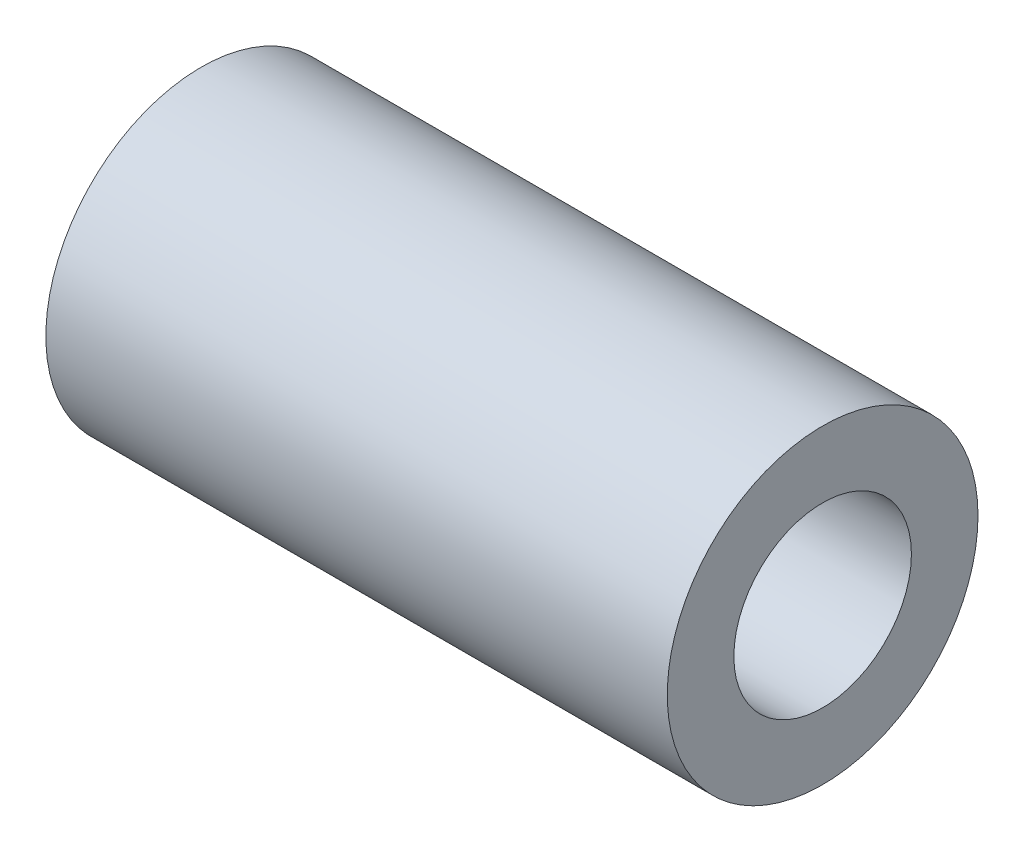
ISO-10303-21;
HEADER;
FILE_DESCRIPTION(('STEP AP214'),'2;1');
FILE_NAME('part.step','',(''),(''),'','','');
FILE_SCHEMA(('AUTOMOTIVE_DESIGN { 1 0 10303 214 1 1 1 1 }'));
ENDSEC;
DATA;
#1=APPLICATION_CONTEXT('core data for automotive mechanical design processes');
#2=APPLICATION_PROTOCOL_DEFINITION('international standard','automotive_design',2000,#1);
#3=PRODUCT_CONTEXT('',#1,'mechanical');
#4=PRODUCT('Part','Part','',(#3));
#5=PRODUCT_RELATED_PRODUCT_CATEGORY('part','',(#4));
#6=PRODUCT_DEFINITION_FORMATION('','',#4);
#7=PRODUCT_DEFINITION_CONTEXT('part definition',#1,'design');
#8=PRODUCT_DEFINITION('design','',#6,#7);
#9=PRODUCT_DEFINITION_SHAPE('','',#8);
#10=(LENGTH_UNIT() NAMED_UNIT(*) SI_UNIT(.MILLI.,.METRE.));
#11=(NAMED_UNIT(*) PLANE_ANGLE_UNIT() SI_UNIT($,.RADIAN.));
#12=(NAMED_UNIT(*) SI_UNIT($,.STERADIAN.) SOLID_ANGLE_UNIT());
#13=UNCERTAINTY_MEASURE_WITH_UNIT(LENGTH_MEASURE(1.E-05),#10,'distance_accuracy_value','');
#14=(GEOMETRIC_REPRESENTATION_CONTEXT(3) GLOBAL_UNCERTAINTY_ASSIGNED_CONTEXT((#13)) GLOBAL_UNIT_ASSIGNED_CONTEXT((#10,
#11,#12)) REPRESENTATION_CONTEXT('',''));
#15=CARTESIAN_POINT('',(0.,0.,0.));
#16=DIRECTION('',(0.,0.,1.));
#17=DIRECTION('',(1.,0.,0.));
#18=AXIS2_PLACEMENT_3D('',#15,#16,#17);
#19=CARTESIAN_POINT('',(-28.,0.,0.));
#20=DIRECTION('',(1.,0.,0.));
#21=DIRECTION('',(0.,0.,-1.));
#22=AXIS2_PLACEMENT_3D('',#19,#20,#21);
#23=CYLINDRICAL_SURFACE('',#22,7.);
#24=CARTESIAN_POINT('',(-28.,0.,0.));
#25=DIRECTION('',(1.,0.,0.));
#26=DIRECTION('',(0.,0.,-1.));
#27=AXIS2_PLACEMENT_3D('',#24,#25,#26);
#28=CIRCLE('',#27,7.);
#29=CARTESIAN_POINT('',(-28.,0.,-7.));
#30=VERTEX_POINT('',#29);
#31=EDGE_CURVE('E12',#30,#30,#28,.T.);
#32=ORIENTED_EDGE('',*,*,#31,.T.);
#33=EDGE_LOOP('',(#32));
#34=FACE_BOUND('',#33,.T.);
#35=CARTESIAN_POINT('',(0.,0.,0.));
#36=DIRECTION('',(1.,0.,0.));
#37=DIRECTION('',(0.,0.,-1.));
#38=AXIS2_PLACEMENT_3D('',#35,#36,#37);
#39=CIRCLE('',#38,7.);
#40=CARTESIAN_POINT('',(0.,0.,-7.));
#41=VERTEX_POINT('',#40);
#42=EDGE_CURVE('E49',#41,#41,#39,.T.);
#43=ORIENTED_EDGE('',*,*,#42,.F.);
#44=EDGE_LOOP('',(#43));
#45=FACE_BOUND('',#44,.T.);
#46=ADVANCED_FACE('F46',(#34,#45),#23,.T.);
#47=CARTESIAN_POINT('',(-28.,0.,0.));
#48=DIRECTION('',(1.,0.,0.));
#49=DIRECTION('',(0.,0.,-1.));
#50=AXIS2_PLACEMENT_3D('',#47,#48,#49);
#51=PLANE('',#50);
#52=CARTESIAN_POINT('',(-28.,0.,0.));
#53=DIRECTION('',(1.,0.,0.));
#54=DIRECTION('',(0.,0.,-1.));
#55=AXIS2_PLACEMENT_3D('',#52,#53,#54);
#56=CIRCLE('',#55,4.);
#57=CARTESIAN_POINT('',(-28.,0.,-4.));
#58=VERTEX_POINT('',#57);
#59=EDGE_CURVE('E56',#58,#58,#56,.T.);
#60=ORIENTED_EDGE('',*,*,#59,.T.);
#61=EDGE_LOOP('',(#60));
#62=FACE_BOUND('',#61,.T.);
#63=ORIENTED_EDGE('',*,*,#31,.F.);
#64=EDGE_LOOP('',(#63));
#65=FACE_BOUND('',#64,.T.);
#66=ADVANCED_FACE('F64',(#62,#65),#51,.F.);
#67=CARTESIAN_POINT('',(0.,0.,0.));
#68=DIRECTION('',(1.,0.,0.));
#69=DIRECTION('',(0.,0.,-1.));
#70=AXIS2_PLACEMENT_3D('',#67,#68,#69);
#71=PLANE('',#70);
#72=CARTESIAN_POINT('',(0.,0.,0.));
#73=DIRECTION('',(1.,0.,0.));
#74=DIRECTION('',(0.,0.,-1.));
#75=AXIS2_PLACEMENT_3D('',#72,#73,#74);
#76=CIRCLE('',#75,4.);
#77=CARTESIAN_POINT('',(0.,0.,-4.));
#78=VERTEX_POINT('',#77);
#79=EDGE_CURVE('E58',#78,#78,#76,.T.);
#80=ORIENTED_EDGE('',*,*,#79,.F.);
#81=EDGE_LOOP('',(#80));
#82=FACE_BOUND('',#81,.T.);
#83=ORIENTED_EDGE('',*,*,#42,.T.);
#84=EDGE_LOOP('',(#83));
#85=FACE_BOUND('',#84,.T.);
#86=ADVANCED_FACE('F70',(#82,#85),#71,.T.);
#87=CARTESIAN_POINT('',(-28.,0.,0.));
#88=DIRECTION('',(1.,0.,0.));
#89=DIRECTION('',(0.,0.,-1.));
#90=AXIS2_PLACEMENT_3D('',#87,#88,#89);
#91=CYLINDRICAL_SURFACE('',#90,4.);
#92=ORIENTED_EDGE('',*,*,#59,.F.);
#93=EDGE_LOOP('',(#92));
#94=FACE_BOUND('',#93,.T.);
#95=ORIENTED_EDGE('',*,*,#79,.T.);
#96=EDGE_LOOP('',(#95));
#97=FACE_BOUND('',#96,.T.);
#98=ADVANCED_FACE('F67',(#94,#97),#91,.F.);
#99=CLOSED_SHELL('',(#46,#66,#86,#98));
#100=MANIFOLD_SOLID_BREP('B2',#99);
#101=ADVANCED_BREP_SHAPE_REPRESENTATION('',(#18,#100),#14);
#102=SHAPE_DEFINITION_REPRESENTATION(#9,#101);
ENDSEC;
END-ISO-10303-21;
